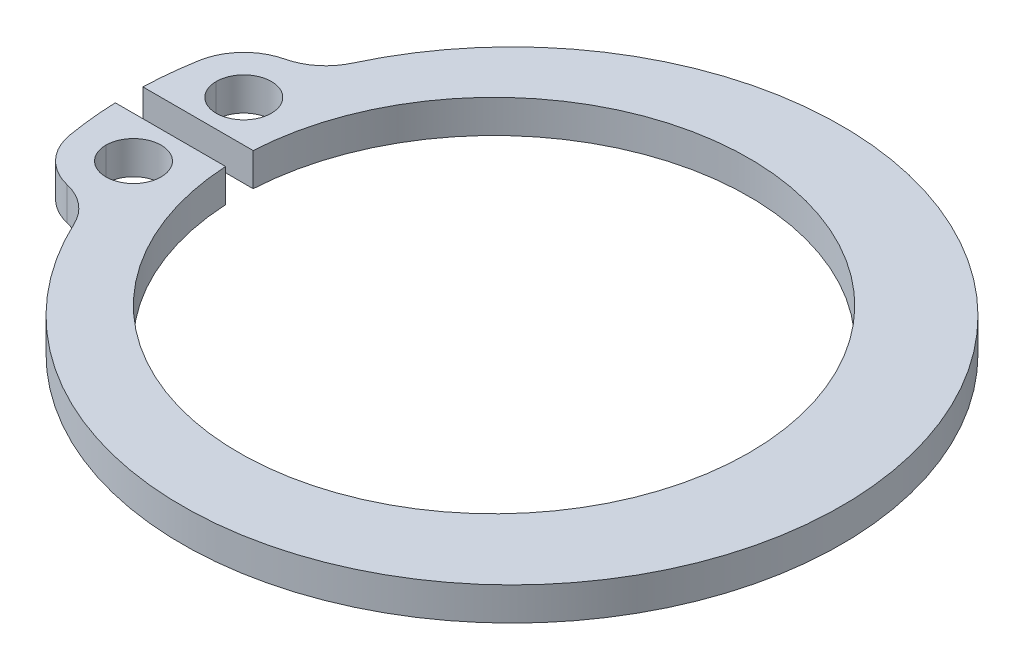
ISO-10303-21;
HEADER;
FILE_DESCRIPTION(('STEP AP214'),'2;1');
FILE_NAME('part.step','',(''),(''),'','','');
FILE_SCHEMA(('AUTOMOTIVE_DESIGN { 1 0 10303 214 1 1 1 1 }'));
ENDSEC;
DATA;
#1=APPLICATION_CONTEXT('core data for automotive mechanical design processes');
#2=APPLICATION_PROTOCOL_DEFINITION('international standard','automotive_design',2000,#1);
#3=PRODUCT_CONTEXT('',#1,'mechanical');
#4=PRODUCT('Part','Part','',(#3));
#5=PRODUCT_RELATED_PRODUCT_CATEGORY('part','',(#4));
#6=PRODUCT_DEFINITION_FORMATION('','',#4);
#7=PRODUCT_DEFINITION_CONTEXT('part definition',#1,'design');
#8=PRODUCT_DEFINITION('design','',#6,#7);
#9=PRODUCT_DEFINITION_SHAPE('','',#8);
#10=(LENGTH_UNIT() NAMED_UNIT(*) SI_UNIT(.MILLI.,.METRE.));
#11=(NAMED_UNIT(*) PLANE_ANGLE_UNIT() SI_UNIT($,.RADIAN.));
#12=(NAMED_UNIT(*) SI_UNIT($,.STERADIAN.) SOLID_ANGLE_UNIT());
#13=UNCERTAINTY_MEASURE_WITH_UNIT(LENGTH_MEASURE(1.E-05),#10,'distance_accuracy_value','');
#14=(GEOMETRIC_REPRESENTATION_CONTEXT(3) GLOBAL_UNCERTAINTY_ASSIGNED_CONTEXT((#13)) GLOBAL_UNIT_ASSIGNED_CONTEXT((#10,
#11,#12)) REPRESENTATION_CONTEXT('',''));
#15=CARTESIAN_POINT('',(0.,0.,0.));
#16=DIRECTION('',(0.,0.,1.));
#17=DIRECTION('',(1.,0.,0.));
#18=AXIS2_PLACEMENT_3D('',#15,#16,#17);
#19=CARTESIAN_POINT('',(-11.99405169759,0.,-5.893255184417));
#20=DIRECTION('',(0.,1.,0.));
#21=DIRECTION('',(1.,0.,0.));
#22=AXIS2_PLACEMENT_3D('',#19,#20,#21);
#23=CYLINDRICAL_SURFACE('',#22,2.);
#24=DIRECTION('',(0.,1.,0.));
#25=VECTOR('',#24,1.);
#26=CARTESIAN_POINT('',(-11.53509525385,0.,-3.946627592208));
#27=LINE('',#26,#25);
#28=CARTESIAN_POINT('',(-11.53509525385,0.,-3.946627592208));
#29=VERTEX_POINT('',#28);
#30=CARTESIAN_POINT('',(-11.53509525385,1.2,-3.946627592208));
#31=VERTEX_POINT('',#30);
#32=EDGE_CURVE('E11',#29,#31,#27,.T.);
#33=ORIENTED_EDGE('',*,*,#32,.T.);
#34=CARTESIAN_POINT('',(-11.99405169759,1.2,-5.893255184417));
#35=DIRECTION('',(0.,-1.,0.));
#36=DIRECTION('',(0.906383634235889,0.,0.422455568775395));
#37=AXIS2_PLACEMENT_3D('',#34,#35,#36);
#38=CIRCLE('',#37,2.);
#39=CARTESIAN_POINT('',(-10.18128442912,1.2,-5.048344046866));
#40=VERTEX_POINT('',#39);
#41=EDGE_CURVE('E161',#40,#31,#38,.T.);
#42=ORIENTED_EDGE('',*,*,#41,.F.);
#43=DIRECTION('',(0.,1.,0.));
#44=VECTOR('',#43,1.);
#45=CARTESIAN_POINT('',(-10.18128442912,0.,-5.048344046866));
#46=LINE('',#45,#44);
#47=CARTESIAN_POINT('',(-10.18128442912,0.,-5.048344046866));
#48=VERTEX_POINT('',#47);
#49=EDGE_CURVE('E242',#48,#40,#46,.T.);
#50=ORIENTED_EDGE('',*,*,#49,.F.);
#51=CARTESIAN_POINT('',(-11.99405169759,0.,-5.893255184417));
#52=DIRECTION('',(0.,-1.,0.));
#53=DIRECTION('',(0.906383634235889,0.,0.422455568775395));
#54=AXIS2_PLACEMENT_3D('',#51,#52,#53);
#55=CIRCLE('',#54,2.);
#56=EDGE_CURVE('E201',#48,#29,#55,.T.);
#57=ORIENTED_EDGE('',*,*,#56,.T.);
#58=EDGE_LOOP('',(#33,#42,#50,#57));
#59=FACE_BOUND('',#58,.T.);
#60=ADVANCED_FACE('F16',(#59),#23,.F.);
#61=CARTESIAN_POINT('',(-11.0761388101,0.,-2.));
#62=DIRECTION('',(0.,1.,0.));
#63=DIRECTION('',(1.,0.,0.));
#64=AXIS2_PLACEMENT_3D('',#61,#62,#63);
#65=CYLINDRICAL_SURFACE('',#64,2.);
#66=DIRECTION('',(0.,1.,0.));
#67=VECTOR('',#66,1.);
#68=CARTESIAN_POINT('',(-13.04766807899,0.,-2.336262311203));
#69=LINE('',#68,#67);
#70=CARTESIAN_POINT('',(-13.04766807899,0.,-2.336262311202));
#71=VERTEX_POINT('',#70);
#72=CARTESIAN_POINT('',(-13.04766807899,1.2,-2.336262311202));
#73=VERTEX_POINT('',#72);
#74=EDGE_CURVE('E24',#71,#73,#69,.T.);
#75=ORIENTED_EDGE('',*,*,#74,.T.);
#76=CARTESIAN_POINT('',(-11.0761388101,1.2,-2.));
#77=DIRECTION('',(0.,1.,0.));
#78=DIRECTION('',(-0.229478221871397,0.,-0.973313796104187));
#79=AXIS2_PLACEMENT_3D('',#76,#77,#78);
#80=CIRCLE('',#79,2.);
#81=EDGE_CURVE('E250',#31,#73,#80,.T.);
#82=ORIENTED_EDGE('',*,*,#81,.F.);
#83=ORIENTED_EDGE('',*,*,#32,.F.);
#84=CARTESIAN_POINT('',(-11.0761388101,0.,-2.));
#85=DIRECTION('',(0.,1.,0.));
#86=DIRECTION('',(-0.229478221871397,0.,-0.973313796104187));
#87=AXIS2_PLACEMENT_3D('',#84,#85,#86);
#88=CIRCLE('',#87,2.);
#89=EDGE_CURVE('E206',#29,#71,#88,.T.);
#90=ORIENTED_EDGE('',*,*,#89,.T.);
#91=EDGE_LOOP('',(#75,#82,#83,#90));
#92=FACE_BOUND('',#91,.T.);
#93=ADVANCED_FACE('F307',(#92),#65,.T.);
#94=CARTESIAN_POINT('',(0.65,0.,0.));
#95=DIRECTION('',(0.,1.,0.));
#96=DIRECTION('',(1.,0.,0.));
#97=AXIS2_PLACEMENT_3D('',#94,#95,#96);
#98=CYLINDRICAL_SURFACE('',#97,13.89547524876);
#99=DIRECTION('',(0.,1.,0.));
#100=VECTOR('',#99,1.);
#101=CARTESIAN_POINT('',(-13.23647660096,0.,-0.5));
#102=LINE('',#101,#100);
#103=CARTESIAN_POINT('',(-13.23647660096,0.,-0.5));
#104=VERTEX_POINT('',#103);
#105=CARTESIAN_POINT('',(-13.23647660096,1.2,-0.5));
#106=VERTEX_POINT('',#105);
#107=EDGE_CURVE('E300',#104,#106,#102,.T.);
#108=ORIENTED_EDGE('',*,*,#107,.T.);
#109=CARTESIAN_POINT('',(0.65,1.2,0.));
#110=DIRECTION('',(0.,1.,0.));
#111=DIRECTION('',(-0.985764634441798,0.,-0.168131155601299));
#112=AXIS2_PLACEMENT_3D('',#109,#110,#111);
#113=CIRCLE('',#112,13.89547524876);
#114=EDGE_CURVE('E254',#73,#106,#113,.T.);
#115=ORIENTED_EDGE('',*,*,#114,.F.);
#116=ORIENTED_EDGE('',*,*,#74,.F.);
#117=CARTESIAN_POINT('',(0.65,0.,0.));
#118=DIRECTION('',(0.,1.,0.));
#119=DIRECTION('',(-0.985764634441798,0.,-0.168131155601299));
#120=AXIS2_PLACEMENT_3D('',#117,#118,#119);
#121=CIRCLE('',#120,13.89547524876);
#122=EDGE_CURVE('E217',#71,#104,#121,.T.);
#123=ORIENTED_EDGE('',*,*,#122,.T.);
#124=EDGE_LOOP('',(#108,#115,#116,#123));
#125=FACE_BOUND('',#124,.T.);
#126=ADVANCED_FACE('F311',(#125),#98,.T.);
#127=CARTESIAN_POINT('',(-13.23647660096,0.,-0.5));
#128=DIRECTION('',(0.,0.,1.));
#129=DIRECTION('',(1.,0.,0.));
#130=AXIS2_PLACEMENT_3D('',#127,#128,#129);
#131=PLANE('',#130);
#132=DIRECTION('',(0.,1.,0.));
#133=VECTOR('',#132,1.);
#134=CARTESIAN_POINT('',(-9.236476600956,0.,-0.5));
#135=LINE('',#134,#133);
#136=CARTESIAN_POINT('',(-9.236476600956,0.,-0.5));
#137=VERTEX_POINT('',#136);
#138=CARTESIAN_POINT('',(-9.236476600956,1.2,-0.5));
#139=VERTEX_POINT('',#138);
#140=EDGE_CURVE('E297',#137,#139,#135,.T.);
#141=ORIENTED_EDGE('',*,*,#140,.T.);
#142=DIRECTION('',(1.,0.,0.));
#143=VECTOR('',#142,1.);
#144=CARTESIAN_POINT('',(-13.23647660096,1.2,-0.5));
#145=LINE('',#144,#143);
#146=EDGE_CURVE('E258',#106,#139,#145,.T.);
#147=ORIENTED_EDGE('',*,*,#146,.F.);
#148=ORIENTED_EDGE('',*,*,#107,.F.);
#149=DIRECTION('',(1.,0.,0.));
#150=VECTOR('',#149,1.);
#151=CARTESIAN_POINT('',(-13.23647660096,0.,-0.5));
#152=LINE('',#151,#150);
#153=EDGE_CURVE('E210',#104,#137,#152,.T.);
#154=ORIENTED_EDGE('',*,*,#153,.T.);
#155=EDGE_LOOP('',(#141,#147,#148,#154));
#156=FACE_BOUND('',#155,.T.);
#157=ADVANCED_FACE('F326',(#156),#131,.T.);
#158=CARTESIAN_POINT('',(0.,0.,0.));
#159=DIRECTION('',(0.,1.,0.));
#160=DIRECTION('',(1.,0.,0.));
#161=AXIS2_PLACEMENT_3D('',#158,#159,#160);
#162=CYLINDRICAL_SURFACE('',#161,9.25);
#163=DIRECTION('',(0.,1.,0.));
#164=VECTOR('',#163,1.);
#165=CARTESIAN_POINT('',(-9.236476600956,0.,0.5));
#166=LINE('',#165,#164);
#167=CARTESIAN_POINT('',(-9.236476600956,0.,0.5));
#168=VERTEX_POINT('',#167);
#169=CARTESIAN_POINT('',(-9.236476600956,1.2,0.5));
#170=VERTEX_POINT('',#169);
#171=EDGE_CURVE('E196',#168,#170,#166,.T.);
#172=ORIENTED_EDGE('',*,*,#171,.T.);
#173=CARTESIAN_POINT('',(0.,1.2,0.));
#174=DIRECTION('',(0.,-1.,0.));
#175=DIRECTION('',(-0.998538010914117,0.,-0.0540540540540509));
#176=AXIS2_PLACEMENT_3D('',#173,#174,#175);
#177=CIRCLE('',#176,9.25);
#178=EDGE_CURVE('E262',#139,#170,#177,.T.);
#179=ORIENTED_EDGE('',*,*,#178,.F.);
#180=ORIENTED_EDGE('',*,*,#140,.F.);
#181=CARTESIAN_POINT('',(0.,0.,0.));
#182=DIRECTION('',(0.,-1.,0.));
#183=DIRECTION('',(-0.998538010914117,0.,-0.0540540540540509));
#184=AXIS2_PLACEMENT_3D('',#181,#182,#183);
#185=CIRCLE('',#184,9.25);
#186=EDGE_CURVE('E192',#137,#168,#185,.T.);
#187=ORIENTED_EDGE('',*,*,#186,.T.);
#188=EDGE_LOOP('',(#172,#179,#180,#187));
#189=FACE_BOUND('',#188,.T.);
#190=ADVANCED_FACE('F330',(#189),#162,.F.);
#191=CARTESIAN_POINT('',(-9.236476600956,0.,0.5));
#192=DIRECTION('',(0.,0.,-1.));
#193=DIRECTION('',(0.,-1.,0.));
#194=AXIS2_PLACEMENT_3D('',#191,#192,#193);
#195=PLANE('',#194);
#196=DIRECTION('',(0.,1.,0.));
#197=VECTOR('',#196,1.);
#198=CARTESIAN_POINT('',(-13.23647660096,0.,0.5));
#199=LINE('',#198,#197);
#200=CARTESIAN_POINT('',(-13.23647660096,0.,0.5));
#201=VERTEX_POINT('',#200);
#202=CARTESIAN_POINT('',(-13.23647660096,1.2,0.5));
#203=VERTEX_POINT('',#202);
#204=EDGE_CURVE('E193',#201,#203,#199,.T.);
#205=ORIENTED_EDGE('',*,*,#204,.T.);
#206=DIRECTION('',(-1.,0.,0.));
#207=VECTOR('',#206,1.);
#208=CARTESIAN_POINT('',(-9.236476600956,1.2,0.5));
#209=LINE('',#208,#207);
#210=EDGE_CURVE('E266',#170,#203,#209,.T.);
#211=ORIENTED_EDGE('',*,*,#210,.F.);
#212=ORIENTED_EDGE('',*,*,#171,.F.);
#213=DIRECTION('',(-1.,0.,0.));
#214=VECTOR('',#213,1.);
#215=CARTESIAN_POINT('',(-9.236476600956,0.,0.5));
#216=LINE('',#215,#214);
#217=EDGE_CURVE('E188',#168,#201,#216,.T.);
#218=ORIENTED_EDGE('',*,*,#217,.T.);
#219=EDGE_LOOP('',(#205,#211,#212,#218));
#220=FACE_BOUND('',#219,.T.);
#221=ADVANCED_FACE('F332',(#220),#195,.T.);
#222=CARTESIAN_POINT('',(0.65,0.,0.));
#223=DIRECTION('',(0.,1.,0.));
#224=DIRECTION('',(1.,0.,0.));
#225=AXIS2_PLACEMENT_3D('',#222,#223,#224);
#226=CYLINDRICAL_SURFACE('',#225,13.89547524876);
#227=DIRECTION('',(0.,1.,0.));
#228=VECTOR('',#227,1.);
#229=CARTESIAN_POINT('',(-13.04766807899,0.,2.336262311203));
#230=LINE('',#229,#228);
#231=CARTESIAN_POINT('',(-13.04766807899,0.,2.336262311203));
#232=VERTEX_POINT('',#231);
#233=CARTESIAN_POINT('',(-13.04766807899,1.2,2.336262311203));
#234=VERTEX_POINT('',#233);
#235=EDGE_CURVE('E197',#232,#234,#230,.T.);
#236=ORIENTED_EDGE('',*,*,#235,.T.);
#237=CARTESIAN_POINT('',(0.65,1.2,0.));
#238=DIRECTION('',(0.,1.,0.));
#239=DIRECTION('',(-0.999352404459525,0.,0.0359829362471509));
#240=AXIS2_PLACEMENT_3D('',#237,#238,#239);
#241=CIRCLE('',#240,13.89547524876);
#242=EDGE_CURVE('E232',#203,#234,#241,.T.);
#243=ORIENTED_EDGE('',*,*,#242,.F.);
#244=ORIENTED_EDGE('',*,*,#204,.F.);
#245=CARTESIAN_POINT('',(0.65,0.,0.));
#246=DIRECTION('',(0.,1.,0.));
#247=DIRECTION('',(-0.999352404459525,0.,0.0359829362471509));
#248=AXIS2_PLACEMENT_3D('',#245,#246,#247);
#249=CIRCLE('',#248,13.89547524876);
#250=EDGE_CURVE('E187',#201,#232,#249,.T.);
#251=ORIENTED_EDGE('',*,*,#250,.T.);
#252=EDGE_LOOP('',(#236,#243,#244,#251));
#253=FACE_BOUND('',#252,.T.);
#254=ADVANCED_FACE('F336',(#253),#226,.T.);
#255=CARTESIAN_POINT('',(-11.0761388101,0.,2.));
#256=DIRECTION('',(0.,1.,0.));
#257=DIRECTION('',(1.,0.,0.));
#258=AXIS2_PLACEMENT_3D('',#255,#256,#257);
#259=CYLINDRICAL_SURFACE('',#258,2.);
#260=DIRECTION('',(0.,1.,0.));
#261=VECTOR('',#260,1.);
#262=CARTESIAN_POINT('',(-11.53509525385,0.,3.946627592208));
#263=LINE('',#262,#261);
#264=CARTESIAN_POINT('',(-11.53509525385,0.,3.946627592208));
#265=VERTEX_POINT('',#264);
#266=CARTESIAN_POINT('',(-11.53509525385,1.2,3.946627592208));
#267=VERTEX_POINT('',#266);
#268=EDGE_CURVE('E213',#265,#267,#263,.T.);
#269=ORIENTED_EDGE('',*,*,#268,.T.);
#270=CARTESIAN_POINT('',(-11.0761388101,1.2,2.));
#271=DIRECTION('',(0.,1.,0.));
#272=DIRECTION('',(-0.985764634441798,0.,0.168131155601299));
#273=AXIS2_PLACEMENT_3D('',#270,#271,#272);
#274=CIRCLE('',#273,2.);
#275=EDGE_CURVE('E227',#234,#267,#274,.T.);
#276=ORIENTED_EDGE('',*,*,#275,.F.);
#277=ORIENTED_EDGE('',*,*,#235,.F.);
#278=CARTESIAN_POINT('',(-11.0761388101,0.,2.));
#279=DIRECTION('',(0.,1.,0.));
#280=DIRECTION('',(-0.985764634441798,0.,0.168131155601299));
#281=AXIS2_PLACEMENT_3D('',#278,#279,#280);
#282=CIRCLE('',#281,2.);
#283=EDGE_CURVE('E184',#232,#265,#282,.T.);
#284=ORIENTED_EDGE('',*,*,#283,.T.);
#285=EDGE_LOOP('',(#269,#276,#277,#284));
#286=FACE_BOUND('',#285,.T.);
#287=ADVANCED_FACE('F340',(#286),#259,.T.);
#288=CARTESIAN_POINT('',(-11.99405169759,0.,5.893255184417));
#289=DIRECTION('',(0.,1.,0.));
#290=DIRECTION('',(1.,0.,0.));
#291=AXIS2_PLACEMENT_3D('',#288,#289,#290);
#292=CYLINDRICAL_SURFACE('',#291,2.);
#293=DIRECTION('',(0.,1.,0.));
#294=VECTOR('',#293,1.);
#295=CARTESIAN_POINT('',(-10.18128442912,0.,5.048344046866));
#296=LINE('',#295,#294);
#297=CARTESIAN_POINT('',(-10.18128442912,0.,5.048344046866));
#298=VERTEX_POINT('',#297);
#299=CARTESIAN_POINT('',(-10.18128442912,1.2,5.048344046866));
#300=VERTEX_POINT('',#299);
#301=EDGE_CURVE('E239',#298,#300,#296,.T.);
#302=ORIENTED_EDGE('',*,*,#301,.T.);
#303=CARTESIAN_POINT('',(-11.99405169759,1.2,5.893255184417));
#304=DIRECTION('',(0.,-1.,0.));
#305=DIRECTION('',(0.229478221871492,0.,-0.973313796104164));
#306=AXIS2_PLACEMENT_3D('',#303,#304,#305);
#307=CIRCLE('',#306,2.);
#308=EDGE_CURVE('E231',#267,#300,#307,.T.);
#309=ORIENTED_EDGE('',*,*,#308,.F.);
#310=ORIENTED_EDGE('',*,*,#268,.F.);
#311=CARTESIAN_POINT('',(-11.99405169759,0.,5.893255184417));
#312=DIRECTION('',(0.,-1.,0.));
#313=DIRECTION('',(0.229478221871492,0.,-0.973313796104164));
#314=AXIS2_PLACEMENT_3D('',#311,#312,#313);
#315=CIRCLE('',#314,2.);
#316=EDGE_CURVE('E183',#265,#298,#315,.T.);
#317=ORIENTED_EDGE('',*,*,#316,.T.);
#318=EDGE_LOOP('',(#302,#309,#310,#317));
#319=FACE_BOUND('',#318,.T.);
#320=ADVANCED_FACE('F344',(#319),#292,.F.);
#321=CARTESIAN_POINT('',(0.65,0.,0.));
#322=DIRECTION('',(0.,1.,0.));
#323=DIRECTION('',(1.,0.,0.));
#324=AXIS2_PLACEMENT_3D('',#321,#322,#323);
#325=CYLINDRICAL_SURFACE('',#324,11.95);
#326=ORIENTED_EDGE('',*,*,#49,.T.);
#327=CARTESIAN_POINT('',(0.65,1.2,0.));
#328=DIRECTION('',(0.,1.,0.));
#329=DIRECTION('',(-0.906383634235889,0.,0.422455568775395));
#330=AXIS2_PLACEMENT_3D('',#327,#328,#329);
#331=CIRCLE('',#330,11.95);
#332=EDGE_CURVE('E276',#300,#40,#331,.T.);
#333=ORIENTED_EDGE('',*,*,#332,.F.);
#334=ORIENTED_EDGE('',*,*,#301,.F.);
#335=CARTESIAN_POINT('',(0.65,0.,0.));
#336=DIRECTION('',(0.,1.,0.));
#337=DIRECTION('',(-0.906383634235889,0.,0.422455568775395));
#338=AXIS2_PLACEMENT_3D('',#335,#336,#337);
#339=CIRCLE('',#338,11.95);
#340=EDGE_CURVE('E205',#298,#48,#339,.T.);
#341=ORIENTED_EDGE('',*,*,#340,.T.);
#342=EDGE_LOOP('',(#326,#333,#334,#341));
#343=FACE_BOUND('',#342,.T.);
#344=ADVANCED_FACE('F346',(#343),#325,.T.);
#345=CARTESIAN_POINT('',(-11.0761388101,0.,-2.));
#346=DIRECTION('',(0.,1.,0.));
#347=DIRECTION('',(1.,0.,0.));
#348=AXIS2_PLACEMENT_3D('',#345,#346,#347);
#349=CYLINDRICAL_SURFACE('',#348,1.);
#350=DIRECTION('',(0.,1.,0.));
#351=VECTOR('',#350,1.);
#352=CARTESIAN_POINT('',(-10.0761388101,0.,-2.));
#353=LINE('',#352,#351);
#354=CARTESIAN_POINT('',(-10.0761388101,0.,-2.));
#355=VERTEX_POINT('',#354);
#356=CARTESIAN_POINT('',(-10.0761388101,1.2,-2.));
#357=VERTEX_POINT('',#356);
#358=EDGE_CURVE('E36',#355,#357,#353,.T.);
#359=ORIENTED_EDGE('',*,*,#358,.T.);
#360=CARTESIAN_POINT('',(-11.0761388101,1.2,-2.));
#361=DIRECTION('',(0.,-1.,0.));
#362=DIRECTION('',(-1.,0.,0.));
#363=AXIS2_PLACEMENT_3D('',#360,#361,#362);
#364=CIRCLE('',#363,1.);
#365=CARTESIAN_POINT('',(-12.0761388101,1.2,-2.));
#366=VERTEX_POINT('',#365);
#367=EDGE_CURVE('E280',#366,#357,#364,.T.);
#368=ORIENTED_EDGE('',*,*,#367,.F.);
#369=DIRECTION('',(0.,1.,0.));
#370=VECTOR('',#369,1.);
#371=CARTESIAN_POINT('',(-12.0761388101,0.,-2.));
#372=LINE('',#371,#370);
#373=CARTESIAN_POINT('',(-12.0761388101,0.,-2.));
#374=VERTEX_POINT('',#373);
#375=EDGE_CURVE('E45',#374,#366,#372,.T.);
#376=ORIENTED_EDGE('',*,*,#375,.F.);
#377=CARTESIAN_POINT('',(-11.0761388101,0.,-2.));
#378=DIRECTION('',(0.,-1.,0.));
#379=DIRECTION('',(-1.,0.,0.));
#380=AXIS2_PLACEMENT_3D('',#377,#378,#379);
#381=CIRCLE('',#380,1.);
#382=EDGE_CURVE('E224',#374,#355,#381,.T.);
#383=ORIENTED_EDGE('',*,*,#382,.T.);
#384=EDGE_LOOP('',(#359,#368,#376,#383));
#385=FACE_BOUND('',#384,.T.);
#386=ADVANCED_FACE('F351',(#385),#349,.F.);
#387=CARTESIAN_POINT('',(-11.0761388101,0.,-2.));
#388=DIRECTION('',(0.,1.,0.));
#389=DIRECTION('',(1.,0.,0.));
#390=AXIS2_PLACEMENT_3D('',#387,#388,#389);
#391=CYLINDRICAL_SURFACE('',#390,1.);
#392=ORIENTED_EDGE('',*,*,#375,.T.);
#393=CARTESIAN_POINT('',(-11.0761388101,1.2,-2.));
#394=DIRECTION('',(0.,-1.,0.));
#395=DIRECTION('',(1.,0.,0.));
#396=AXIS2_PLACEMENT_3D('',#393,#394,#395);
#397=CIRCLE('',#396,1.);
#398=EDGE_CURVE('E284',#357,#366,#397,.T.);
#399=ORIENTED_EDGE('',*,*,#398,.F.);
#400=ORIENTED_EDGE('',*,*,#358,.F.);
#401=CARTESIAN_POINT('',(-11.0761388101,0.,-2.));
#402=DIRECTION('',(0.,-1.,0.));
#403=DIRECTION('',(1.,0.,0.));
#404=AXIS2_PLACEMENT_3D('',#401,#402,#403);
#405=CIRCLE('',#404,1.);
#406=EDGE_CURVE('E223',#355,#374,#405,.T.);
#407=ORIENTED_EDGE('',*,*,#406,.T.);
#408=EDGE_LOOP('',(#392,#399,#400,#407));
#409=FACE_BOUND('',#408,.T.);
#410=ADVANCED_FACE('F358',(#409),#391,.F.);
#411=CARTESIAN_POINT('',(0.,1.2,0.));
#412=DIRECTION('',(0.,1.,0.));
#413=DIRECTION('',(1.,0.,0.));
#414=AXIS2_PLACEMENT_3D('',#411,#412,#413);
#415=PLANE('',#414);
#416=CARTESIAN_POINT('',(-11.0761388101,1.2,2.));
#417=DIRECTION('',(0.,-1.,0.));
#418=DIRECTION('',(-1.,0.,0.));
#419=AXIS2_PLACEMENT_3D('',#416,#417,#418);
#420=CIRCLE('',#419,1.);
#421=CARTESIAN_POINT('',(-12.0761388101,1.2,2.));
#422=VERTEX_POINT('',#421);
#423=CARTESIAN_POINT('',(-10.0761388101,1.2,2.));
#424=VERTEX_POINT('',#423);
#425=EDGE_CURVE('E150',#422,#424,#420,.T.);
#426=ORIENTED_EDGE('',*,*,#425,.T.);
#427=CARTESIAN_POINT('',(-11.0761388101,1.2,2.));
#428=DIRECTION('',(0.,-1.,0.));
#429=DIRECTION('',(1.,0.,0.));
#430=AXIS2_PLACEMENT_3D('',#427,#428,#429);
#431=CIRCLE('',#430,1.);
#432=EDGE_CURVE('E163',#424,#422,#431,.T.);
#433=ORIENTED_EDGE('',*,*,#432,.T.);
#434=EDGE_LOOP('',(#426,#433));
#435=FACE_BOUND('',#434,.T.);
#436=ORIENTED_EDGE('',*,*,#367,.T.);
#437=ORIENTED_EDGE('',*,*,#398,.T.);
#438=EDGE_LOOP('',(#436,#437));
#439=FACE_BOUND('',#438,.T.);
#440=ORIENTED_EDGE('',*,*,#41,.T.);
#441=ORIENTED_EDGE('',*,*,#81,.T.);
#442=ORIENTED_EDGE('',*,*,#114,.T.);
#443=ORIENTED_EDGE('',*,*,#146,.T.);
#444=ORIENTED_EDGE('',*,*,#178,.T.);
#445=ORIENTED_EDGE('',*,*,#210,.T.);
#446=ORIENTED_EDGE('',*,*,#242,.T.);
#447=ORIENTED_EDGE('',*,*,#275,.T.);
#448=ORIENTED_EDGE('',*,*,#308,.T.);
#449=ORIENTED_EDGE('',*,*,#332,.T.);
#450=EDGE_LOOP('',(#440,#441,#442,#443,#444,#445,#446,#447,#448,#449));
#451=FACE_BOUND('',#450,.T.);
#452=ADVANCED_FACE('F164',(#435,#439,#451),#415,.T.);
#453=CARTESIAN_POINT('',(-11.0761388101,0.,2.));
#454=DIRECTION('',(0.,1.,0.));
#455=DIRECTION('',(1.,0.,0.));
#456=AXIS2_PLACEMENT_3D('',#453,#454,#455);
#457=CYLINDRICAL_SURFACE('',#456,1.);
#458=DIRECTION('',(0.,1.,0.));
#459=VECTOR('',#458,1.);
#460=CARTESIAN_POINT('',(-10.0761388101,0.,2.));
#461=LINE('',#460,#459);
#462=CARTESIAN_POINT('',(-10.0761388101,0.,2.));
#463=VERTEX_POINT('',#462);
#464=EDGE_CURVE('E157',#463,#424,#461,.T.);
#465=ORIENTED_EDGE('',*,*,#464,.T.);
#466=ORIENTED_EDGE('',*,*,#425,.F.);
#467=DIRECTION('',(0.,1.,0.));
#468=VECTOR('',#467,1.);
#469=CARTESIAN_POINT('',(-12.0761388101,0.,2.));
#470=LINE('',#469,#468);
#471=CARTESIAN_POINT('',(-12.0761388101,0.,2.));
#472=VERTEX_POINT('',#471);
#473=EDGE_CURVE('E155',#472,#422,#470,.T.);
#474=ORIENTED_EDGE('',*,*,#473,.F.);
#475=CARTESIAN_POINT('',(-11.0761388101,0.,2.));
#476=DIRECTION('',(0.,-1.,0.));
#477=DIRECTION('',(-1.,0.,0.));
#478=AXIS2_PLACEMENT_3D('',#475,#476,#477);
#479=CIRCLE('',#478,1.);
#480=EDGE_CURVE('E179',#472,#463,#479,.T.);
#481=ORIENTED_EDGE('',*,*,#480,.T.);
#482=EDGE_LOOP('',(#465,#466,#474,#481));
#483=FACE_BOUND('',#482,.T.);
#484=ADVANCED_FACE('F152',(#483),#457,.F.);
#485=CARTESIAN_POINT('',(-11.0761388101,0.,2.));
#486=DIRECTION('',(0.,1.,0.));
#487=DIRECTION('',(1.,0.,0.));
#488=AXIS2_PLACEMENT_3D('',#485,#486,#487);
#489=CYLINDRICAL_SURFACE('',#488,1.);
#490=ORIENTED_EDGE('',*,*,#473,.T.);
#491=ORIENTED_EDGE('',*,*,#432,.F.);
#492=ORIENTED_EDGE('',*,*,#464,.F.);
#493=CARTESIAN_POINT('',(-11.0761388101,0.,2.));
#494=DIRECTION('',(0.,-1.,0.));
#495=DIRECTION('',(1.,0.,0.));
#496=AXIS2_PLACEMENT_3D('',#493,#494,#495);
#497=CIRCLE('',#496,1.);
#498=EDGE_CURVE('E171',#463,#472,#497,.T.);
#499=ORIENTED_EDGE('',*,*,#498,.T.);
#500=EDGE_LOOP('',(#490,#491,#492,#499));
#501=FACE_BOUND('',#500,.T.);
#502=ADVANCED_FACE('F169',(#501),#489,.F.);
#503=CARTESIAN_POINT('',(0.,0.,0.));
#504=DIRECTION('',(0.,1.,0.));
#505=DIRECTION('',(1.,0.,0.));
#506=AXIS2_PLACEMENT_3D('',#503,#504,#505);
#507=PLANE('',#506);
#508=ORIENTED_EDGE('',*,*,#480,.F.);
#509=ORIENTED_EDGE('',*,*,#498,.F.);
#510=EDGE_LOOP('',(#508,#509));
#511=FACE_BOUND('',#510,.T.);
#512=ORIENTED_EDGE('',*,*,#382,.F.);
#513=ORIENTED_EDGE('',*,*,#406,.F.);
#514=EDGE_LOOP('',(#512,#513));
#515=FACE_BOUND('',#514,.T.);
#516=ORIENTED_EDGE('',*,*,#316,.F.);
#517=ORIENTED_EDGE('',*,*,#283,.F.);
#518=ORIENTED_EDGE('',*,*,#250,.F.);
#519=ORIENTED_EDGE('',*,*,#217,.F.);
#520=ORIENTED_EDGE('',*,*,#186,.F.);
#521=ORIENTED_EDGE('',*,*,#153,.F.);
#522=ORIENTED_EDGE('',*,*,#122,.F.);
#523=ORIENTED_EDGE('',*,*,#89,.F.);
#524=ORIENTED_EDGE('',*,*,#56,.F.);
#525=ORIENTED_EDGE('',*,*,#340,.F.);
#526=EDGE_LOOP('',(#516,#517,#518,#519,#520,#521,#522,#523,#524,#525));
#527=FACE_BOUND('',#526,.T.);
#528=ADVANCED_FACE('F321',(#511,#515,#527),#507,.F.);
#529=CLOSED_SHELL('',(#60,#93,#126,#157,#190,#221,#254,#287,#320,#344,#386,#410,#452,#484,#502,#528));
#530=MANIFOLD_SOLID_BREP('B1',#529);
#531=ADVANCED_BREP_SHAPE_REPRESENTATION('',(#18,#530),#14);
#532=SHAPE_DEFINITION_REPRESENTATION(#9,#531);
ENDSEC;
END-ISO-10303-21;
